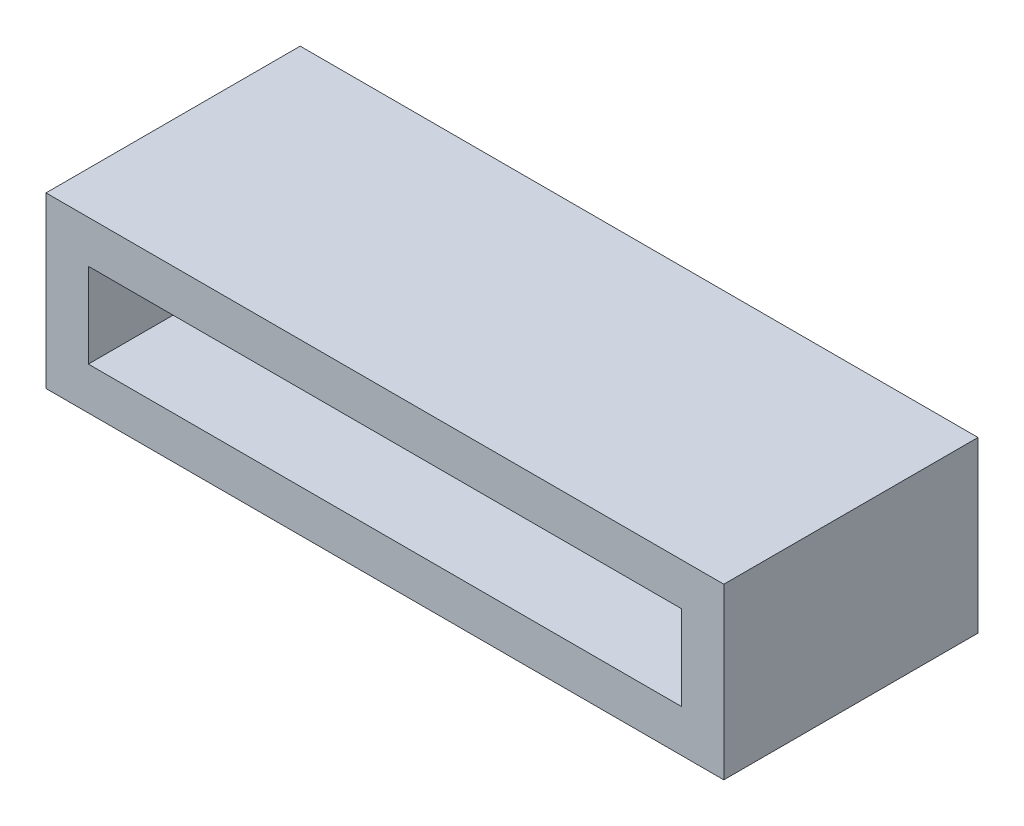
ISO-10303-21;
HEADER;
FILE_DESCRIPTION(('STEP AP214'),'2;1');
FILE_NAME('part.step','',(''),(''),'','','');
FILE_SCHEMA(('AUTOMOTIVE_DESIGN { 1 0 10303 214 1 1 1 1 }'));
ENDSEC;
DATA;
#1=APPLICATION_CONTEXT('core data for automotive mechanical design processes');
#2=APPLICATION_PROTOCOL_DEFINITION('international standard','automotive_design',2000,#1);
#3=PRODUCT_CONTEXT('',#1,'mechanical');
#4=PRODUCT('Part','Part','',(#3));
#5=PRODUCT_RELATED_PRODUCT_CATEGORY('part','',(#4));
#6=PRODUCT_DEFINITION_FORMATION('','',#4);
#7=PRODUCT_DEFINITION_CONTEXT('part definition',#1,'design');
#8=PRODUCT_DEFINITION('design','',#6,#7);
#9=PRODUCT_DEFINITION_SHAPE('','',#8);
#10=(LENGTH_UNIT() NAMED_UNIT(*) SI_UNIT(.MILLI.,.METRE.));
#11=(NAMED_UNIT(*) PLANE_ANGLE_UNIT() SI_UNIT($,.RADIAN.));
#12=(NAMED_UNIT(*) SI_UNIT($,.STERADIAN.) SOLID_ANGLE_UNIT());
#13=UNCERTAINTY_MEASURE_WITH_UNIT(LENGTH_MEASURE(1.E-05),#10,'distance_accuracy_value','');
#14=(GEOMETRIC_REPRESENTATION_CONTEXT(3) GLOBAL_UNCERTAINTY_ASSIGNED_CONTEXT((#13)) GLOBAL_UNIT_ASSIGNED_CONTEXT((#10,
#11,#12)) REPRESENTATION_CONTEXT('',''));
#15=CARTESIAN_POINT('',(0.,0.,0.));
#16=DIRECTION('',(0.,0.,1.));
#17=DIRECTION('',(1.,0.,0.));
#18=AXIS2_PLACEMENT_3D('',#15,#16,#17);
#19=CARTESIAN_POINT('',(0.,0.,6.));
#20=DIRECTION('',(0.,0.,-1.));
#21=DIRECTION('',(-1.,0.,0.));
#22=AXIS2_PLACEMENT_3D('',#19,#20,#21);
#23=PLANE('',#22);
#24=DIRECTION('',(0.,1.,0.));
#25=VECTOR('',#24,1.);
#26=CARTESIAN_POINT('',(8.,-2.,6.));
#27=LINE('',#26,#25);
#28=CARTESIAN_POINT('',(8.,-2.,6.));
#29=VERTEX_POINT('',#28);
#30=CARTESIAN_POINT('',(8.,2.,6.));
#31=VERTEX_POINT('',#30);
#32=EDGE_CURVE('E137',#29,#31,#27,.T.);
#33=ORIENTED_EDGE('',*,*,#32,.T.);
#34=DIRECTION('',(-1.,0.,0.));
#35=VECTOR('',#34,1.);
#36=CARTESIAN_POINT('',(-8.,2.,6.));
#37=LINE('',#36,#35);
#38=CARTESIAN_POINT('',(-8.,2.,6.));
#39=VERTEX_POINT('',#38);
#40=EDGE_CURVE('E140',#31,#39,#37,.T.);
#41=ORIENTED_EDGE('',*,*,#40,.T.);
#42=DIRECTION('',(0.,-1.,0.));
#43=VECTOR('',#42,1.);
#44=CARTESIAN_POINT('',(-8.,-2.,6.));
#45=LINE('',#44,#43);
#46=CARTESIAN_POINT('',(-8.,-2.,6.));
#47=VERTEX_POINT('',#46);
#48=EDGE_CURVE('E143',#39,#47,#45,.T.);
#49=ORIENTED_EDGE('',*,*,#48,.T.);
#50=DIRECTION('',(1.,0.,0.));
#51=VECTOR('',#50,1.);
#52=CARTESIAN_POINT('',(-8.,-2.,6.));
#53=LINE('',#52,#51);
#54=EDGE_CURVE('E145',#47,#29,#53,.T.);
#55=ORIENTED_EDGE('',*,*,#54,.T.);
#56=EDGE_LOOP('',(#33,#41,#49,#55));
#57=FACE_BOUND('',#56,.T.);
#58=DIRECTION('',(0.,-1.,0.));
#59=VECTOR('',#58,1.);
#60=CARTESIAN_POINT('',(-7.,-1.,6.));
#61=LINE('',#60,#59);
#62=CARTESIAN_POINT('',(-7.,1.,6.));
#63=VERTEX_POINT('',#62);
#64=CARTESIAN_POINT('',(-7.,-1.,6.));
#65=VERTEX_POINT('',#64);
#66=EDGE_CURVE('E101',#63,#65,#61,.T.);
#67=ORIENTED_EDGE('',*,*,#66,.F.);
#68=DIRECTION('',(-1.,0.,0.));
#69=VECTOR('',#68,1.);
#70=CARTESIAN_POINT('',(-7.,1.,6.));
#71=LINE('',#70,#69);
#72=CARTESIAN_POINT('',(7.,1.,6.));
#73=VERTEX_POINT('',#72);
#74=EDGE_CURVE('E123',#73,#63,#71,.T.);
#75=ORIENTED_EDGE('',*,*,#74,.F.);
#76=DIRECTION('',(0.,1.,0.));
#77=VECTOR('',#76,1.);
#78=CARTESIAN_POINT('',(7.,-1.,6.));
#79=LINE('',#78,#77);
#80=CARTESIAN_POINT('',(7.,-1.,6.));
#81=VERTEX_POINT('',#80);
#82=EDGE_CURVE('E121',#81,#73,#79,.T.);
#83=ORIENTED_EDGE('',*,*,#82,.F.);
#84=DIRECTION('',(1.,0.,0.));
#85=VECTOR('',#84,1.);
#86=CARTESIAN_POINT('',(-7.,-1.,6.));
#87=LINE('',#86,#85);
#88=EDGE_CURVE('E109',#65,#81,#87,.T.);
#89=ORIENTED_EDGE('',*,*,#88,.F.);
#90=EDGE_LOOP('',(#67,#75,#83,#89));
#91=FACE_BOUND('',#90,.T.);
#92=ADVANCED_FACE('F36',(#57,#91),#23,.F.);
#93=CARTESIAN_POINT('',(0.,0.,0.));
#94=DIRECTION('',(0.,0.,-1.));
#95=DIRECTION('',(-1.,0.,0.));
#96=AXIS2_PLACEMENT_3D('',#93,#94,#95);
#97=PLANE('',#96);
#98=DIRECTION('',(0.,1.,0.));
#99=VECTOR('',#98,1.);
#100=CARTESIAN_POINT('',(8.,-2.,0.));
#101=LINE('',#100,#99);
#102=CARTESIAN_POINT('',(8.,-2.,0.));
#103=VERTEX_POINT('',#102);
#104=CARTESIAN_POINT('',(8.,2.,0.));
#105=VERTEX_POINT('',#104);
#106=EDGE_CURVE('E117',#103,#105,#101,.T.);
#107=ORIENTED_EDGE('',*,*,#106,.F.);
#108=DIRECTION('',(1.,0.,0.));
#109=VECTOR('',#108,1.);
#110=CARTESIAN_POINT('',(-8.,-2.,0.));
#111=LINE('',#110,#109);
#112=CARTESIAN_POINT('',(-8.,-2.,0.));
#113=VERTEX_POINT('',#112);
#114=EDGE_CURVE('E141',#113,#103,#111,.T.);
#115=ORIENTED_EDGE('',*,*,#114,.F.);
#116=DIRECTION('',(0.,-1.,0.));
#117=VECTOR('',#116,1.);
#118=CARTESIAN_POINT('',(-8.,-2.,0.));
#119=LINE('',#118,#117);
#120=CARTESIAN_POINT('',(-8.,2.,0.));
#121=VERTEX_POINT('',#120);
#122=EDGE_CURVE('E152',#121,#113,#119,.T.);
#123=ORIENTED_EDGE('',*,*,#122,.F.);
#124=DIRECTION('',(-1.,0.,0.));
#125=VECTOR('',#124,1.);
#126=CARTESIAN_POINT('',(-8.,2.,0.));
#127=LINE('',#126,#125);
#128=EDGE_CURVE('E150',#105,#121,#127,.T.);
#129=ORIENTED_EDGE('',*,*,#128,.F.);
#130=EDGE_LOOP('',(#107,#115,#123,#129));
#131=FACE_BOUND('',#130,.T.);
#132=DIRECTION('',(-1.,0.,0.));
#133=VECTOR('',#132,1.);
#134=CARTESIAN_POINT('',(-7.,1.,0.));
#135=LINE('',#134,#133);
#136=CARTESIAN_POINT('',(7.,1.,0.));
#137=VERTEX_POINT('',#136);
#138=CARTESIAN_POINT('',(-7.,1.,0.));
#139=VERTEX_POINT('',#138);
#140=EDGE_CURVE('E110',#137,#139,#135,.T.);
#141=ORIENTED_EDGE('',*,*,#140,.T.);
#142=DIRECTION('',(0.,-1.,0.));
#143=VECTOR('',#142,1.);
#144=CARTESIAN_POINT('',(-7.,-1.,0.));
#145=LINE('',#144,#143);
#146=CARTESIAN_POINT('',(-7.,-1.,0.));
#147=VERTEX_POINT('',#146);
#148=EDGE_CURVE('E59',#139,#147,#145,.T.);
#149=ORIENTED_EDGE('',*,*,#148,.T.);
#150=DIRECTION('',(1.,0.,0.));
#151=VECTOR('',#150,1.);
#152=CARTESIAN_POINT('',(-7.,-1.,0.));
#153=LINE('',#152,#151);
#154=CARTESIAN_POINT('',(7.,-1.,0.));
#155=VERTEX_POINT('',#154);
#156=EDGE_CURVE('E116',#147,#155,#153,.T.);
#157=ORIENTED_EDGE('',*,*,#156,.T.);
#158=DIRECTION('',(0.,1.,0.));
#159=VECTOR('',#158,1.);
#160=CARTESIAN_POINT('',(7.,-1.,0.));
#161=LINE('',#160,#159);
#162=EDGE_CURVE('E129',#155,#137,#161,.T.);
#163=ORIENTED_EDGE('',*,*,#162,.T.);
#164=EDGE_LOOP('',(#141,#149,#157,#163));
#165=FACE_BOUND('',#164,.T.);
#166=ADVANCED_FACE('F170',(#131,#165),#97,.T.);
#167=CARTESIAN_POINT('',(8.,-2.,6.));
#168=DIRECTION('',(-1.,0.,0.));
#169=DIRECTION('',(0.,0.,1.));
#170=AXIS2_PLACEMENT_3D('',#167,#168,#169);
#171=PLANE('',#170);
#172=ORIENTED_EDGE('',*,*,#106,.T.);
#173=DIRECTION('',(0.,0.,-1.));
#174=VECTOR('',#173,1.);
#175=CARTESIAN_POINT('',(8.,2.,6.));
#176=LINE('',#175,#174);
#177=EDGE_CURVE('E11',#31,#105,#176,.T.);
#178=ORIENTED_EDGE('',*,*,#177,.F.);
#179=ORIENTED_EDGE('',*,*,#32,.F.);
#180=DIRECTION('',(0.,0.,-1.));
#181=VECTOR('',#180,1.);
#182=CARTESIAN_POINT('',(8.,-2.,6.));
#183=LINE('',#182,#181);
#184=EDGE_CURVE('E147',#29,#103,#183,.T.);
#185=ORIENTED_EDGE('',*,*,#184,.T.);
#186=EDGE_LOOP('',(#172,#178,#179,#185));
#187=FACE_BOUND('',#186,.T.);
#188=ADVANCED_FACE('F38',(#187),#171,.F.);
#189=CARTESIAN_POINT('',(-8.,2.,6.));
#190=DIRECTION('',(0.,-1.,0.));
#191=DIRECTION('',(0.,0.,-1.));
#192=AXIS2_PLACEMENT_3D('',#189,#190,#191);
#193=PLANE('',#192);
#194=ORIENTED_EDGE('',*,*,#128,.T.);
#195=DIRECTION('',(0.,0.,-1.));
#196=VECTOR('',#195,1.);
#197=CARTESIAN_POINT('',(-8.,2.,6.));
#198=LINE('',#197,#196);
#199=EDGE_CURVE('E44',#39,#121,#198,.T.);
#200=ORIENTED_EDGE('',*,*,#199,.F.);
#201=ORIENTED_EDGE('',*,*,#40,.F.);
#202=ORIENTED_EDGE('',*,*,#177,.T.);
#203=EDGE_LOOP('',(#194,#200,#201,#202));
#204=FACE_BOUND('',#203,.T.);
#205=ADVANCED_FACE('F180',(#204),#193,.F.);
#206=CARTESIAN_POINT('',(-8.,-2.,6.));
#207=DIRECTION('',(1.,0.,0.));
#208=DIRECTION('',(0.,0.,-1.));
#209=AXIS2_PLACEMENT_3D('',#206,#207,#208);
#210=PLANE('',#209);
#211=ORIENTED_EDGE('',*,*,#122,.T.);
#212=DIRECTION('',(0.,0.,-1.));
#213=VECTOR('',#212,1.);
#214=CARTESIAN_POINT('',(-8.,-2.,6.));
#215=LINE('',#214,#213);
#216=EDGE_CURVE('E157',#47,#113,#215,.T.);
#217=ORIENTED_EDGE('',*,*,#216,.F.);
#218=ORIENTED_EDGE('',*,*,#48,.F.);
#219=ORIENTED_EDGE('',*,*,#199,.T.);
#220=EDGE_LOOP('',(#211,#217,#218,#219));
#221=FACE_BOUND('',#220,.T.);
#222=ADVANCED_FACE('F164',(#221),#210,.F.);
#223=CARTESIAN_POINT('',(-8.,-2.,6.));
#224=DIRECTION('',(0.,1.,0.));
#225=DIRECTION('',(0.,0.,1.));
#226=AXIS2_PLACEMENT_3D('',#223,#224,#225);
#227=PLANE('',#226);
#228=ORIENTED_EDGE('',*,*,#114,.T.);
#229=ORIENTED_EDGE('',*,*,#184,.F.);
#230=ORIENTED_EDGE('',*,*,#54,.F.);
#231=ORIENTED_EDGE('',*,*,#216,.T.);
#232=EDGE_LOOP('',(#228,#229,#230,#231));
#233=FACE_BOUND('',#232,.T.);
#234=ADVANCED_FACE('F174',(#233),#227,.F.);
#235=CARTESIAN_POINT('',(-7.,-1.,6.));
#236=DIRECTION('',(1.,0.,0.));
#237=DIRECTION('',(0.,0.,-1.));
#238=AXIS2_PLACEMENT_3D('',#235,#236,#237);
#239=PLANE('',#238);
#240=ORIENTED_EDGE('',*,*,#148,.F.);
#241=DIRECTION('',(0.,0.,-1.));
#242=VECTOR('',#241,1.);
#243=CARTESIAN_POINT('',(-7.,1.,6.));
#244=LINE('',#243,#242);
#245=EDGE_CURVE('E105',#63,#139,#244,.T.);
#246=ORIENTED_EDGE('',*,*,#245,.F.);
#247=ORIENTED_EDGE('',*,*,#66,.T.);
#248=DIRECTION('',(0.,0.,-1.));
#249=VECTOR('',#248,1.);
#250=CARTESIAN_POINT('',(-7.,-1.,6.));
#251=LINE('',#250,#249);
#252=EDGE_CURVE('E104',#65,#147,#251,.T.);
#253=ORIENTED_EDGE('',*,*,#252,.T.);
#254=EDGE_LOOP('',(#240,#246,#247,#253));
#255=FACE_BOUND('',#254,.T.);
#256=ADVANCED_FACE('F103',(#255),#239,.T.);
#257=CARTESIAN_POINT('',(-7.,-1.,6.));
#258=DIRECTION('',(0.,1.,0.));
#259=DIRECTION('',(0.,0.,1.));
#260=AXIS2_PLACEMENT_3D('',#257,#258,#259);
#261=PLANE('',#260);
#262=ORIENTED_EDGE('',*,*,#156,.F.);
#263=ORIENTED_EDGE('',*,*,#252,.F.);
#264=ORIENTED_EDGE('',*,*,#88,.T.);
#265=DIRECTION('',(0.,0.,-1.));
#266=VECTOR('',#265,1.);
#267=CARTESIAN_POINT('',(7.,-1.,6.));
#268=LINE('',#267,#266);
#269=EDGE_CURVE('E118',#81,#155,#268,.T.);
#270=ORIENTED_EDGE('',*,*,#269,.T.);
#271=EDGE_LOOP('',(#262,#263,#264,#270));
#272=FACE_BOUND('',#271,.T.);
#273=ADVANCED_FACE('F113',(#272),#261,.T.);
#274=CARTESIAN_POINT('',(7.,-1.,6.));
#275=DIRECTION('',(-1.,0.,0.));
#276=DIRECTION('',(0.,0.,1.));
#277=AXIS2_PLACEMENT_3D('',#274,#275,#276);
#278=PLANE('',#277);
#279=ORIENTED_EDGE('',*,*,#162,.F.);
#280=ORIENTED_EDGE('',*,*,#269,.F.);
#281=ORIENTED_EDGE('',*,*,#82,.T.);
#282=DIRECTION('',(0.,0.,-1.));
#283=VECTOR('',#282,1.);
#284=CARTESIAN_POINT('',(7.,1.,6.));
#285=LINE('',#284,#283);
#286=EDGE_CURVE('E51',#73,#137,#285,.T.);
#287=ORIENTED_EDGE('',*,*,#286,.T.);
#288=EDGE_LOOP('',(#279,#280,#281,#287));
#289=FACE_BOUND('',#288,.T.);
#290=ADVANCED_FACE('F203',(#289),#278,.T.);
#291=CARTESIAN_POINT('',(-7.,1.,6.));
#292=DIRECTION('',(0.,-1.,0.));
#293=DIRECTION('',(0.,0.,-1.));
#294=AXIS2_PLACEMENT_3D('',#291,#292,#293);
#295=PLANE('',#294);
#296=ORIENTED_EDGE('',*,*,#140,.F.);
#297=ORIENTED_EDGE('',*,*,#286,.F.);
#298=ORIENTED_EDGE('',*,*,#74,.T.);
#299=ORIENTED_EDGE('',*,*,#245,.T.);
#300=EDGE_LOOP('',(#296,#297,#298,#299));
#301=FACE_BOUND('',#300,.T.);
#302=ADVANCED_FACE('F207',(#301),#295,.T.);
#303=CLOSED_SHELL('',(#92,#166,#188,#205,#222,#234,#256,#273,#290,#302));
#304=MANIFOLD_SOLID_BREP('B2',#303);
#305=ADVANCED_BREP_SHAPE_REPRESENTATION('',(#18,#304),#14);
#306=SHAPE_DEFINITION_REPRESENTATION(#9,#305);
ENDSEC;
END-ISO-10303-21;
